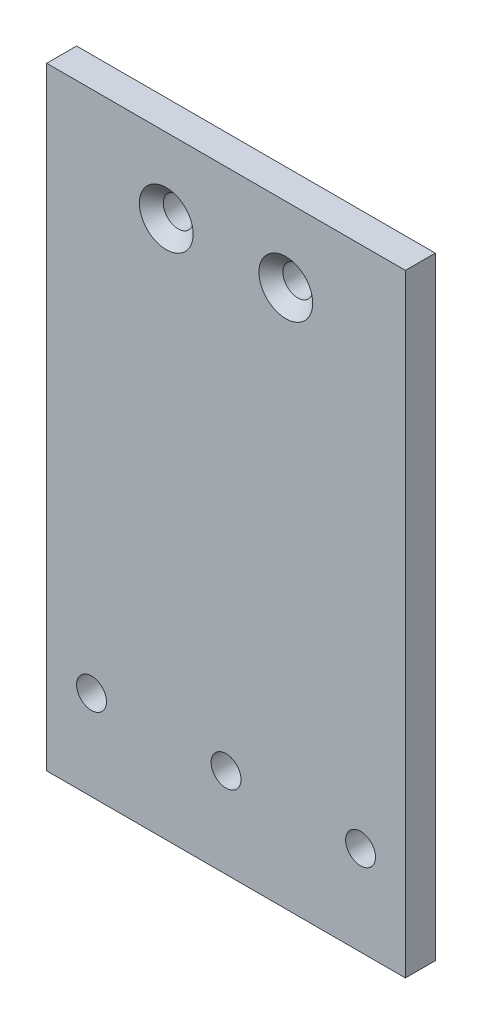
ISO-10303-21;
HEADER;
FILE_DESCRIPTION(('STEP AP214'),'2;1');
FILE_NAME('part.step','',(''),(''),'','','');
FILE_SCHEMA(('AUTOMOTIVE_DESIGN { 1 0 10303 214 1 1 1 1 }'));
ENDSEC;
DATA;
#1=APPLICATION_CONTEXT('core data for automotive mechanical design processes');
#2=APPLICATION_PROTOCOL_DEFINITION('international standard','automotive_design',2000,#1);
#3=PRODUCT_CONTEXT('',#1,'mechanical');
#4=PRODUCT('Part','Part','',(#3));
#5=PRODUCT_RELATED_PRODUCT_CATEGORY('part','',(#4));
#6=PRODUCT_DEFINITION_FORMATION('','',#4);
#7=PRODUCT_DEFINITION_CONTEXT('part definition',#1,'design');
#8=PRODUCT_DEFINITION('design','',#6,#7);
#9=PRODUCT_DEFINITION_SHAPE('','',#8);
#10=(LENGTH_UNIT() NAMED_UNIT(*) SI_UNIT(.MILLI.,.METRE.));
#11=(NAMED_UNIT(*) PLANE_ANGLE_UNIT() SI_UNIT($,.RADIAN.));
#12=(NAMED_UNIT(*) SI_UNIT($,.STERADIAN.) SOLID_ANGLE_UNIT());
#13=UNCERTAINTY_MEASURE_WITH_UNIT(LENGTH_MEASURE(1.E-05),#10,'distance_accuracy_value','');
#14=(GEOMETRIC_REPRESENTATION_CONTEXT(3) GLOBAL_UNCERTAINTY_ASSIGNED_CONTEXT((#13)) GLOBAL_UNIT_ASSIGNED_CONTEXT((#10,
#11,#12)) REPRESENTATION_CONTEXT('',''));
#15=CARTESIAN_POINT('',(0.,0.,0.));
#16=DIRECTION('',(0.,0.,1.));
#17=DIRECTION('',(1.,0.,0.));
#18=AXIS2_PLACEMENT_3D('',#15,#16,#17);
#19=CARTESIAN_POINT('',(38.1,69.85,6.35));
#20=DIRECTION('',(-1.,0.,0.));
#21=DIRECTION('',(0.,-1.,0.));
#22=AXIS2_PLACEMENT_3D('',#19,#20,#21);
#23=PLANE('',#22);
#24=DIRECTION('',(0.,1.,0.));
#25=VECTOR('',#24,1.);
#26=CARTESIAN_POINT('',(38.1,69.85,0.));
#27=LINE('',#26,#25);
#28=CARTESIAN_POINT('',(38.1,-69.85,0.));
#29=VERTEX_POINT('',#28);
#30=CARTESIAN_POINT('',(38.1,60.325,0.));
#31=VERTEX_POINT('',#30);
#32=EDGE_CURVE('E86',#29,#31,#27,.T.);
#33=ORIENTED_EDGE('',*,*,#32,.T.);
#34=DIRECTION('',(0.,0.,1.));
#35=VECTOR('',#34,1.);
#36=CARTESIAN_POINT('',(38.1,60.325,0.));
#37=LINE('',#36,#35);
#38=CARTESIAN_POINT('',(38.1,60.325,6.35));
#39=VERTEX_POINT('',#38);
#40=EDGE_CURVE('E49',#31,#39,#37,.T.);
#41=ORIENTED_EDGE('',*,*,#40,.T.);
#42=DIRECTION('',(0.,1.,0.));
#43=VECTOR('',#42,1.);
#44=CARTESIAN_POINT('',(38.1,69.85,6.35));
#45=LINE('',#44,#43);
#46=CARTESIAN_POINT('',(38.1,-69.85,6.35));
#47=VERTEX_POINT('',#46);
#48=EDGE_CURVE('E81',#47,#39,#45,.T.);
#49=ORIENTED_EDGE('',*,*,#48,.F.);
#50=DIRECTION('',(0.,0.,-1.));
#51=VECTOR('',#50,1.);
#52=CARTESIAN_POINT('',(38.1,-69.85,6.35));
#53=LINE('',#52,#51);
#54=EDGE_CURVE('E74',#47,#29,#53,.T.);
#55=ORIENTED_EDGE('',*,*,#54,.T.);
#56=EDGE_LOOP('',(#33,#41,#49,#55));
#57=FACE_BOUND('',#56,.T.);
#58=ADVANCED_FACE('F34',(#57),#23,.F.);
#59=CARTESIAN_POINT('',(-38.1,69.85,6.35));
#60=DIRECTION('',(1.,0.,0.));
#61=DIRECTION('',(0.,1.,0.));
#62=AXIS2_PLACEMENT_3D('',#59,#60,#61);
#63=PLANE('',#62);
#64=DIRECTION('',(0.,-1.,0.));
#65=VECTOR('',#64,1.);
#66=CARTESIAN_POINT('',(-38.1,69.85,6.35));
#67=LINE('',#66,#65);
#68=CARTESIAN_POINT('',(-38.1,60.325,6.35));
#69=VERTEX_POINT('',#68);
#70=CARTESIAN_POINT('',(-38.1,-69.85,6.35));
#71=VERTEX_POINT('',#70);
#72=EDGE_CURVE('E133',#69,#71,#67,.T.);
#73=ORIENTED_EDGE('',*,*,#72,.F.);
#74=DIRECTION('',(0.,0.,1.));
#75=VECTOR('',#74,1.);
#76=CARTESIAN_POINT('',(-38.1,60.325,0.));
#77=LINE('',#76,#75);
#78=CARTESIAN_POINT('',(-38.1,60.325,0.));
#79=VERTEX_POINT('',#78);
#80=EDGE_CURVE('E143',#79,#69,#77,.T.);
#81=ORIENTED_EDGE('',*,*,#80,.F.);
#82=DIRECTION('',(0.,-1.,0.));
#83=VECTOR('',#82,1.);
#84=CARTESIAN_POINT('',(-38.1,69.85,0.));
#85=LINE('',#84,#83);
#86=CARTESIAN_POINT('',(-38.1,-69.85,0.));
#87=VERTEX_POINT('',#86);
#88=EDGE_CURVE('E82',#79,#87,#85,.T.);
#89=ORIENTED_EDGE('',*,*,#88,.T.);
#90=DIRECTION('',(0.,0.,-1.));
#91=VECTOR('',#90,1.);
#92=CARTESIAN_POINT('',(-38.1,-69.85,6.35));
#93=LINE('',#92,#91);
#94=EDGE_CURVE('E77',#71,#87,#93,.T.);
#95=ORIENTED_EDGE('',*,*,#94,.F.);
#96=EDGE_LOOP('',(#73,#81,#89,#95));
#97=FACE_BOUND('',#96,.T.);
#98=ADVANCED_FACE('F140',(#97),#63,.F.);
#99=CARTESIAN_POINT('',(-38.1,-69.85,6.35));
#100=DIRECTION('',(0.,1.,0.));
#101=DIRECTION('',(0.,0.,1.));
#102=AXIS2_PLACEMENT_3D('',#99,#100,#101);
#103=PLANE('',#102);
#104=DIRECTION('',(1.,0.,0.));
#105=VECTOR('',#104,1.);
#106=CARTESIAN_POINT('',(-38.1,-69.85,0.));
#107=LINE('',#106,#105);
#108=EDGE_CURVE('E71',#87,#29,#107,.T.);
#109=ORIENTED_EDGE('',*,*,#108,.T.);
#110=ORIENTED_EDGE('',*,*,#54,.F.);
#111=DIRECTION('',(1.,0.,0.));
#112=VECTOR('',#111,1.);
#113=CARTESIAN_POINT('',(-38.1,-69.85,6.35));
#114=LINE('',#113,#112);
#115=EDGE_CURVE('E58',#71,#47,#114,.T.);
#116=ORIENTED_EDGE('',*,*,#115,.F.);
#117=ORIENTED_EDGE('',*,*,#94,.T.);
#118=EDGE_LOOP('',(#109,#110,#116,#117));
#119=FACE_BOUND('',#118,.T.);
#120=ADVANCED_FACE('F73',(#119),#103,.F.);
#121=CARTESIAN_POINT('',(0.,0.,6.35));
#122=DIRECTION('',(0.,0.,1.));
#123=DIRECTION('',(1.,0.,0.));
#124=AXIS2_PLACEMENT_3D('',#121,#122,#123);
#125=PLANE('',#124);
#126=DIRECTION('',(-1.,0.,0.));
#127=VECTOR('',#126,1.);
#128=CARTESIAN_POINT('',(38.1,60.325,6.35));
#129=LINE('',#128,#127);
#130=EDGE_CURVE('E137',#39,#69,#129,.T.);
#131=ORIENTED_EDGE('',*,*,#130,.T.);
#132=ORIENTED_EDGE('',*,*,#72,.T.);
#133=ORIENTED_EDGE('',*,*,#115,.T.);
#134=ORIENTED_EDGE('',*,*,#48,.T.);
#135=EDGE_LOOP('',(#131,#132,#133,#134));
#136=FACE_BOUND('',#135,.T.);
#137=CARTESIAN_POINT('',(12.7,44.45,6.35));
#138=DIRECTION('',(0.,0.,1.));
#139=DIRECTION('',(1.,0.,0.));
#140=AXIS2_PLACEMENT_3D('',#137,#138,#139);
#141=CIRCLE('',#140,5.71500000000003);
#142=CARTESIAN_POINT('',(18.415,44.45,6.35));
#143=VERTEX_POINT('',#142);
#144=EDGE_CURVE('E42',#143,#143,#141,.F.);
#145=ORIENTED_EDGE('',*,*,#144,.T.);
#146=EDGE_LOOP('',(#145));
#147=FACE_BOUND('',#146,.T.);
#148=CARTESIAN_POINT('',(-12.7,44.45,6.35));
#149=DIRECTION('',(0.,0.,1.));
#150=DIRECTION('',(1.,0.,0.));
#151=AXIS2_PLACEMENT_3D('',#148,#149,#150);
#152=CIRCLE('',#151,5.71500000000003);
#153=CARTESIAN_POINT('',(-6.98499999999998,44.45,6.35));
#154=VERTEX_POINT('',#153);
#155=EDGE_CURVE('E103',#154,#154,#152,.F.);
#156=ORIENTED_EDGE('',*,*,#155,.T.);
#157=EDGE_LOOP('',(#156));
#158=FACE_BOUND('',#157,.T.);
#159=CARTESIAN_POINT('',(28.575,-50.8,6.35));
#160=DIRECTION('',(0.,0.,1.));
#161=DIRECTION('',(1.,0.,0.));
#162=AXIS2_PLACEMENT_3D('',#159,#160,#161);
#163=CIRCLE('',#162,3.17500000000001);
#164=CARTESIAN_POINT('',(31.75,-50.8,6.35));
#165=VERTEX_POINT('',#164);
#166=EDGE_CURVE('E147',#165,#165,#163,.T.);
#167=ORIENTED_EDGE('',*,*,#166,.F.);
#168=EDGE_LOOP('',(#167));
#169=FACE_BOUND('',#168,.T.);
#170=CARTESIAN_POINT('',(0.,-50.8,6.35));
#171=DIRECTION('',(0.,0.,1.));
#172=DIRECTION('',(1.,0.,0.));
#173=AXIS2_PLACEMENT_3D('',#170,#171,#172);
#174=CIRCLE('',#173,3.175);
#175=CARTESIAN_POINT('',(3.17499999999999,-50.8,6.35));
#176=VERTEX_POINT('',#175);
#177=EDGE_CURVE('E156',#176,#176,#174,.T.);
#178=ORIENTED_EDGE('',*,*,#177,.F.);
#179=EDGE_LOOP('',(#178));
#180=FACE_BOUND('',#179,.T.);
#181=CARTESIAN_POINT('',(-28.575,-50.8,6.35));
#182=DIRECTION('',(0.,0.,1.));
#183=DIRECTION('',(1.,0.,0.));
#184=AXIS2_PLACEMENT_3D('',#181,#182,#183);
#185=CIRCLE('',#184,3.175);
#186=CARTESIAN_POINT('',(-25.4,-50.8,6.35));
#187=VERTEX_POINT('',#186);
#188=EDGE_CURVE('E129',#187,#187,#185,.T.);
#189=ORIENTED_EDGE('',*,*,#188,.F.);
#190=EDGE_LOOP('',(#189));
#191=FACE_BOUND('',#190,.T.);
#192=ADVANCED_FACE('F108',(#136,#147,#158,#169,#180,#191),#125,.T.);
#193=CARTESIAN_POINT('',(0.,0.,0.));
#194=DIRECTION('',(0.,0.,1.));
#195=DIRECTION('',(1.,0.,0.));
#196=AXIS2_PLACEMENT_3D('',#193,#194,#195);
#197=PLANE('',#196);
#198=CARTESIAN_POINT('',(28.575,-50.8,0.));
#199=DIRECTION('',(0.,0.,1.));
#200=DIRECTION('',(1.,0.,0.));
#201=AXIS2_PLACEMENT_3D('',#198,#199,#200);
#202=CIRCLE('',#201,3.17500000000001);
#203=CARTESIAN_POINT('',(31.75,-50.8,0.));
#204=VERTEX_POINT('',#203);
#205=EDGE_CURVE('E153',#204,#204,#202,.T.);
#206=ORIENTED_EDGE('',*,*,#205,.T.);
#207=EDGE_LOOP('',(#206));
#208=FACE_BOUND('',#207,.T.);
#209=CARTESIAN_POINT('',(0.,-50.8,0.));
#210=DIRECTION('',(0.,0.,1.));
#211=DIRECTION('',(1.,0.,0.));
#212=AXIS2_PLACEMENT_3D('',#209,#210,#211);
#213=CIRCLE('',#212,3.175);
#214=CARTESIAN_POINT('',(3.17499999999999,-50.8,0.));
#215=VERTEX_POINT('',#214);
#216=EDGE_CURVE('E159',#215,#215,#213,.T.);
#217=ORIENTED_EDGE('',*,*,#216,.T.);
#218=EDGE_LOOP('',(#217));
#219=FACE_BOUND('',#218,.T.);
#220=CARTESIAN_POINT('',(-28.575,-50.8,0.));
#221=DIRECTION('',(0.,0.,1.));
#222=DIRECTION('',(1.,0.,0.));
#223=AXIS2_PLACEMENT_3D('',#220,#221,#222);
#224=CIRCLE('',#223,3.175);
#225=CARTESIAN_POINT('',(-25.4,-50.8,0.));
#226=VERTEX_POINT('',#225);
#227=EDGE_CURVE('E126',#226,#226,#224,.T.);
#228=ORIENTED_EDGE('',*,*,#227,.T.);
#229=EDGE_LOOP('',(#228));
#230=FACE_BOUND('',#229,.T.);
#231=CARTESIAN_POINT('',(12.7,44.45,0.));
#232=DIRECTION('',(0.,0.,1.));
#233=DIRECTION('',(1.,0.,0.));
#234=AXIS2_PLACEMENT_3D('',#231,#232,#233);
#235=CIRCLE('',#234,3.175);
#236=CARTESIAN_POINT('',(15.875,44.45,0.));
#237=VERTEX_POINT('',#236);
#238=EDGE_CURVE('E94',#237,#237,#235,.T.);
#239=ORIENTED_EDGE('',*,*,#238,.T.);
#240=EDGE_LOOP('',(#239));
#241=FACE_BOUND('',#240,.T.);
#242=CARTESIAN_POINT('',(-12.7,44.45,0.));
#243=DIRECTION('',(0.,0.,1.));
#244=DIRECTION('',(1.,0.,0.));
#245=AXIS2_PLACEMENT_3D('',#242,#243,#244);
#246=CIRCLE('',#245,3.175);
#247=CARTESIAN_POINT('',(-9.52500000000001,44.45,0.));
#248=VERTEX_POINT('',#247);
#249=EDGE_CURVE('E90',#248,#248,#246,.T.);
#250=ORIENTED_EDGE('',*,*,#249,.T.);
#251=EDGE_LOOP('',(#250));
#252=FACE_BOUND('',#251,.T.);
#253=ORIENTED_EDGE('',*,*,#88,.F.);
#254=DIRECTION('',(-1.,0.,0.));
#255=VECTOR('',#254,1.);
#256=CARTESIAN_POINT('',(38.1,60.325,0.));
#257=LINE('',#256,#255);
#258=EDGE_CURVE('E89',#31,#79,#257,.T.);
#259=ORIENTED_EDGE('',*,*,#258,.F.);
#260=ORIENTED_EDGE('',*,*,#32,.F.);
#261=ORIENTED_EDGE('',*,*,#108,.F.);
#262=EDGE_LOOP('',(#253,#259,#260,#261));
#263=FACE_BOUND('',#262,.T.);
#264=ADVANCED_FACE('F88',(#208,#219,#230,#241,#252,#263),#197,.F.);
#265=CARTESIAN_POINT('',(-12.7,44.45,0.));
#266=DIRECTION('',(0.,0.,1.));
#267=DIRECTION('',(1.,0.,0.));
#268=AXIS2_PLACEMENT_3D('',#265,#266,#267);
#269=CYLINDRICAL_SURFACE('',#268,3.175);
#270=CARTESIAN_POINT('',(-12.7,44.45,3.80999999999999));
#271=DIRECTION('',(0.,0.,1.));
#272=DIRECTION('',(1.,0.,0.));
#273=AXIS2_PLACEMENT_3D('',#270,#271,#272);
#274=CIRCLE('',#273,3.175);
#275=CARTESIAN_POINT('',(-9.52500000000001,44.45,3.80999999999999));
#276=VERTEX_POINT('',#275);
#277=EDGE_CURVE('E11',#276,#276,#274,.T.);
#278=ORIENTED_EDGE('',*,*,#277,.T.);
#279=EDGE_LOOP('',(#278));
#280=FACE_BOUND('',#279,.T.);
#281=ORIENTED_EDGE('',*,*,#249,.F.);
#282=EDGE_LOOP('',(#281));
#283=FACE_BOUND('',#282,.T.);
#284=ADVANCED_FACE('F121',(#280,#283),#269,.F.);
#285=CARTESIAN_POINT('',(12.7,44.45,0.));
#286=DIRECTION('',(0.,0.,1.));
#287=DIRECTION('',(1.,0.,0.));
#288=AXIS2_PLACEMENT_3D('',#285,#286,#287);
#289=CYLINDRICAL_SURFACE('',#288,3.175);
#290=CARTESIAN_POINT('',(12.7,44.45,3.80999999999999));
#291=DIRECTION('',(0.,0.,1.));
#292=DIRECTION('',(1.,0.,0.));
#293=AXIS2_PLACEMENT_3D('',#290,#291,#292);
#294=CIRCLE('',#293,3.175);
#295=CARTESIAN_POINT('',(15.875,44.45,3.80999999999999));
#296=VERTEX_POINT('',#295);
#297=EDGE_CURVE('E100',#296,#296,#294,.T.);
#298=ORIENTED_EDGE('',*,*,#297,.T.);
#299=EDGE_LOOP('',(#298));
#300=FACE_BOUND('',#299,.T.);
#301=ORIENTED_EDGE('',*,*,#238,.F.);
#302=EDGE_LOOP('',(#301));
#303=FACE_BOUND('',#302,.T.);
#304=ADVANCED_FACE('F117',(#300,#303),#289,.F.);
#305=CARTESIAN_POINT('',(-28.575,-50.8,0.));
#306=DIRECTION('',(0.,0.,1.));
#307=DIRECTION('',(1.,0.,0.));
#308=AXIS2_PLACEMENT_3D('',#305,#306,#307);
#309=CYLINDRICAL_SURFACE('',#308,3.175);
#310=ORIENTED_EDGE('',*,*,#227,.F.);
#311=EDGE_LOOP('',(#310));
#312=FACE_BOUND('',#311,.T.);
#313=ORIENTED_EDGE('',*,*,#188,.T.);
#314=EDGE_LOOP('',(#313));
#315=FACE_BOUND('',#314,.T.);
#316=ADVANCED_FACE('F120',(#312,#315),#309,.F.);
#317=CARTESIAN_POINT('',(0.,-50.8,0.));
#318=DIRECTION('',(0.,0.,1.));
#319=DIRECTION('',(1.,0.,0.));
#320=AXIS2_PLACEMENT_3D('',#317,#318,#319);
#321=CYLINDRICAL_SURFACE('',#320,3.175);
#322=ORIENTED_EDGE('',*,*,#216,.F.);
#323=EDGE_LOOP('',(#322));
#324=FACE_BOUND('',#323,.T.);
#325=ORIENTED_EDGE('',*,*,#177,.T.);
#326=EDGE_LOOP('',(#325));
#327=FACE_BOUND('',#326,.T.);
#328=ADVANCED_FACE('F165',(#324,#327),#321,.F.);
#329=CARTESIAN_POINT('',(28.575,-50.8,0.));
#330=DIRECTION('',(0.,0.,1.));
#331=DIRECTION('',(1.,0.,0.));
#332=AXIS2_PLACEMENT_3D('',#329,#330,#331);
#333=CYLINDRICAL_SURFACE('',#332,3.17500000000001);
#334=ORIENTED_EDGE('',*,*,#205,.F.);
#335=EDGE_LOOP('',(#334));
#336=FACE_BOUND('',#335,.T.);
#337=ORIENTED_EDGE('',*,*,#166,.T.);
#338=EDGE_LOOP('',(#337));
#339=FACE_BOUND('',#338,.T.);
#340=ADVANCED_FACE('F114',(#336,#339),#333,.F.);
#341=CARTESIAN_POINT('',(12.7,44.45,3.80999999999999));
#342=DIRECTION('',(0.,0.,1.));
#343=DIRECTION('',(1.,0.,0.));
#344=AXIS2_PLACEMENT_3D('',#341,#342,#343);
#345=CONICAL_SURFACE('',#344,3.175,0.785398163397451);
#346=ORIENTED_EDGE('',*,*,#144,.F.);
#347=EDGE_LOOP('',(#346));
#348=FACE_BOUND('',#347,.T.);
#349=ORIENTED_EDGE('',*,*,#297,.F.);
#350=EDGE_LOOP('',(#349));
#351=FACE_BOUND('',#350,.T.);
#352=ADVANCED_FACE('F111',(#348,#351),#345,.F.);
#353=CARTESIAN_POINT('',(-12.7,44.45,3.80999999999999));
#354=DIRECTION('',(0.,0.,1.));
#355=DIRECTION('',(1.,0.,0.));
#356=AXIS2_PLACEMENT_3D('',#353,#354,#355);
#357=CONICAL_SURFACE('',#356,3.175,0.785398163397451);
#358=ORIENTED_EDGE('',*,*,#155,.F.);
#359=EDGE_LOOP('',(#358));
#360=FACE_BOUND('',#359,.T.);
#361=ORIENTED_EDGE('',*,*,#277,.F.);
#362=EDGE_LOOP('',(#361));
#363=FACE_BOUND('',#362,.T.);
#364=ADVANCED_FACE('F36',(#360,#363),#357,.F.);
#365=CARTESIAN_POINT('',(38.1,60.325,0.));
#366=DIRECTION('',(0.,-1.,0.));
#367=DIRECTION('',(1.,0.,0.));
#368=AXIS2_PLACEMENT_3D('',#365,#366,#367);
#369=PLANE('',#368);
#370=ORIENTED_EDGE('',*,*,#80,.T.);
#371=ORIENTED_EDGE('',*,*,#130,.F.);
#372=ORIENTED_EDGE('',*,*,#40,.F.);
#373=ORIENTED_EDGE('',*,*,#258,.T.);
#374=EDGE_LOOP('',(#370,#371,#372,#373));
#375=FACE_BOUND('',#374,.T.);
#376=ADVANCED_FACE('F146',(#375),#369,.F.);
#377=CLOSED_SHELL('',(#58,#98,#120,#192,#264,#284,#304,#316,#328,#340,#352,#364,#376));
#378=MANIFOLD_SOLID_BREP('B2',#377);
#379=ADVANCED_BREP_SHAPE_REPRESENTATION('',(#18,#378),#14);
#380=SHAPE_DEFINITION_REPRESENTATION(#9,#379);
ENDSEC;
END-ISO-10303-21;
